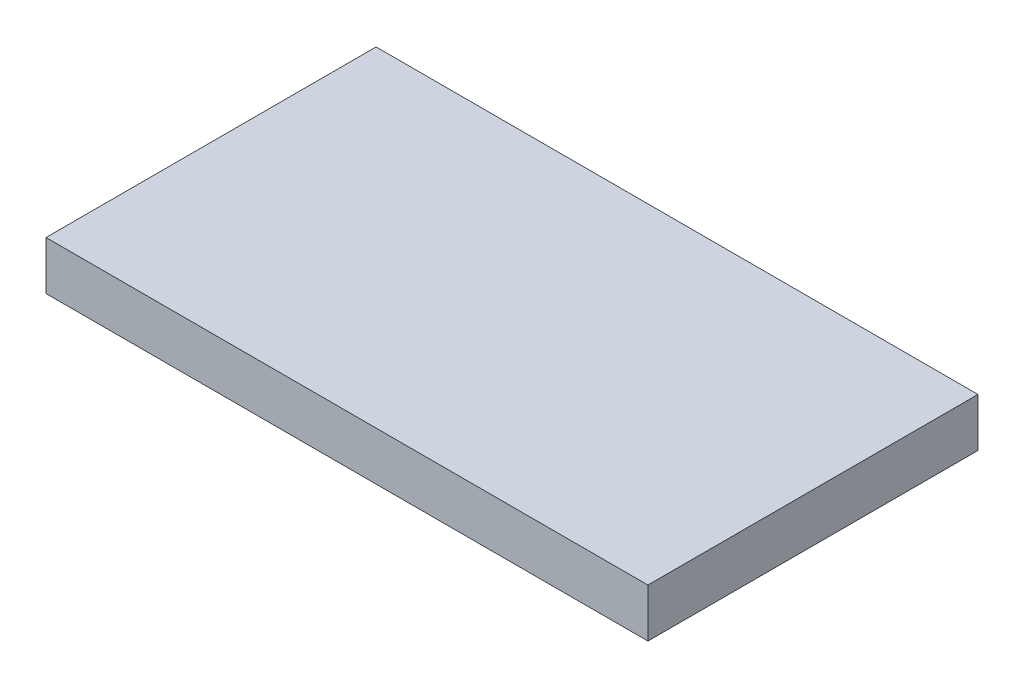
ISO-10303-21;
HEADER;
FILE_DESCRIPTION(('STEP AP214'),'2;1');
FILE_NAME('part.step','',(''),(''),'','','');
FILE_SCHEMA(('AUTOMOTIVE_DESIGN { 1 0 10303 214 1 1 1 1 }'));
ENDSEC;
DATA;
#1=APPLICATION_CONTEXT('core data for automotive mechanical design processes');
#2=APPLICATION_PROTOCOL_DEFINITION('international standard','automotive_design',2000,#1);
#3=PRODUCT_CONTEXT('',#1,'mechanical');
#4=PRODUCT('Part','Part','',(#3));
#5=PRODUCT_RELATED_PRODUCT_CATEGORY('part','',(#4));
#6=PRODUCT_DEFINITION_FORMATION('','',#4);
#7=PRODUCT_DEFINITION_CONTEXT('part definition',#1,'design');
#8=PRODUCT_DEFINITION('design','',#6,#7);
#9=PRODUCT_DEFINITION_SHAPE('','',#8);
#10=(LENGTH_UNIT() NAMED_UNIT(*) SI_UNIT(.MILLI.,.METRE.));
#11=(NAMED_UNIT(*) PLANE_ANGLE_UNIT() SI_UNIT($,.RADIAN.));
#12=(NAMED_UNIT(*) SI_UNIT($,.STERADIAN.) SOLID_ANGLE_UNIT());
#13=UNCERTAINTY_MEASURE_WITH_UNIT(LENGTH_MEASURE(1.E-05),#10,'distance_accuracy_value','');
#14=(GEOMETRIC_REPRESENTATION_CONTEXT(3) GLOBAL_UNCERTAINTY_ASSIGNED_CONTEXT((#13)) GLOBAL_UNIT_ASSIGNED_CONTEXT((#10,
#11,#12)) REPRESENTATION_CONTEXT('',''));
#15=CARTESIAN_POINT('',(0.,0.,0.));
#16=DIRECTION('',(0.,0.,1.));
#17=DIRECTION('',(1.,0.,0.));
#18=AXIS2_PLACEMENT_3D('',#15,#16,#17);
#19=CARTESIAN_POINT('',(0.,5.,0.));
#20=DIRECTION('',(1.,0.,0.));
#21=DIRECTION('',(0.,0.,-1.));
#22=AXIS2_PLACEMENT_3D('',#19,#20,#21);
#23=PLANE('',#22);
#24=DIRECTION('',(0.,0.,1.));
#25=VECTOR('',#24,1.);
#26=CARTESIAN_POINT('',(0.,0.,0.));
#27=LINE('',#26,#25);
#28=CARTESIAN_POINT('',(0.,0.,-34.));
#29=VERTEX_POINT('',#28);
#30=CARTESIAN_POINT('',(0.,0.,0.));
#31=VERTEX_POINT('',#30);
#32=EDGE_CURVE('E96',#29,#31,#27,.T.);
#33=ORIENTED_EDGE('',*,*,#32,.T.);
#34=DIRECTION('',(0.,-1.,0.));
#35=VECTOR('',#34,1.);
#36=CARTESIAN_POINT('',(0.,5.,0.));
#37=LINE('',#36,#35);
#38=CARTESIAN_POINT('',(0.,5.,0.));
#39=VERTEX_POINT('',#38);
#40=EDGE_CURVE('E11',#39,#31,#37,.T.);
#41=ORIENTED_EDGE('',*,*,#40,.F.);
#42=DIRECTION('',(0.,0.,1.));
#43=VECTOR('',#42,1.);
#44=CARTESIAN_POINT('',(0.,5.,0.));
#45=LINE('',#44,#43);
#46=CARTESIAN_POINT('',(0.,5.,-34.));
#47=VERTEX_POINT('',#46);
#48=EDGE_CURVE('E84',#47,#39,#45,.T.);
#49=ORIENTED_EDGE('',*,*,#48,.F.);
#50=DIRECTION('',(0.,-1.,0.));
#51=VECTOR('',#50,1.);
#52=CARTESIAN_POINT('',(0.,5.,-34.));
#53=LINE('',#52,#51);
#54=EDGE_CURVE('E92',#47,#29,#53,.T.);
#55=ORIENTED_EDGE('',*,*,#54,.T.);
#56=EDGE_LOOP('',(#33,#41,#49,#55));
#57=FACE_BOUND('',#56,.T.);
#58=ADVANCED_FACE('F33',(#57),#23,.F.);
#59=CARTESIAN_POINT('',(0.,5.,0.));
#60=DIRECTION('',(0.,0.,-1.));
#61=DIRECTION('',(-1.,0.,0.));
#62=AXIS2_PLACEMENT_3D('',#59,#60,#61);
#63=PLANE('',#62);
#64=DIRECTION('',(1.,0.,0.));
#65=VECTOR('',#64,1.);
#66=CARTESIAN_POINT('',(0.,0.,0.));
#67=LINE('',#66,#65);
#68=CARTESIAN_POINT('',(62.,0.,0.));
#69=VERTEX_POINT('',#68);
#70=EDGE_CURVE('E88',#31,#69,#67,.T.);
#71=ORIENTED_EDGE('',*,*,#70,.T.);
#72=DIRECTION('',(0.,-1.,0.));
#73=VECTOR('',#72,1.);
#74=CARTESIAN_POINT('',(62.,5.,0.));
#75=LINE('',#74,#73);
#76=CARTESIAN_POINT('',(62.,5.,0.));
#77=VERTEX_POINT('',#76);
#78=EDGE_CURVE('E41',#77,#69,#75,.T.);
#79=ORIENTED_EDGE('',*,*,#78,.F.);
#80=DIRECTION('',(1.,0.,0.));
#81=VECTOR('',#80,1.);
#82=CARTESIAN_POINT('',(0.,5.,0.));
#83=LINE('',#82,#81);
#84=EDGE_CURVE('E79',#39,#77,#83,.T.);
#85=ORIENTED_EDGE('',*,*,#84,.F.);
#86=ORIENTED_EDGE('',*,*,#40,.T.);
#87=EDGE_LOOP('',(#71,#79,#85,#86));
#88=FACE_BOUND('',#87,.T.);
#89=ADVANCED_FACE('F87',(#88),#63,.F.);
#90=CARTESIAN_POINT('',(62.,5.,0.));
#91=DIRECTION('',(-1.,0.,0.));
#92=DIRECTION('',(0.,0.,1.));
#93=AXIS2_PLACEMENT_3D('',#90,#91,#92);
#94=PLANE('',#93);
#95=DIRECTION('',(0.,0.,-1.));
#96=VECTOR('',#95,1.);
#97=CARTESIAN_POINT('',(62.,0.,0.));
#98=LINE('',#97,#96);
#99=CARTESIAN_POINT('',(62.,0.,-34.));
#100=VERTEX_POINT('',#99);
#101=EDGE_CURVE('E66',#69,#100,#98,.T.);
#102=ORIENTED_EDGE('',*,*,#101,.T.);
#103=DIRECTION('',(0.,-1.,0.));
#104=VECTOR('',#103,1.);
#105=CARTESIAN_POINT('',(62.,5.,-34.));
#106=LINE('',#105,#104);
#107=CARTESIAN_POINT('',(62.,5.,-34.));
#108=VERTEX_POINT('',#107);
#109=EDGE_CURVE('E89',#108,#100,#106,.T.);
#110=ORIENTED_EDGE('',*,*,#109,.F.);
#111=DIRECTION('',(0.,0.,-1.));
#112=VECTOR('',#111,1.);
#113=CARTESIAN_POINT('',(62.,5.,0.));
#114=LINE('',#113,#112);
#115=EDGE_CURVE('E82',#77,#108,#114,.T.);
#116=ORIENTED_EDGE('',*,*,#115,.F.);
#117=ORIENTED_EDGE('',*,*,#78,.T.);
#118=EDGE_LOOP('',(#102,#110,#116,#117));
#119=FACE_BOUND('',#118,.T.);
#120=ADVANCED_FACE('F90',(#119),#94,.F.);
#121=CARTESIAN_POINT('',(0.,5.,-34.));
#122=DIRECTION('',(0.,0.,1.));
#123=DIRECTION('',(1.,0.,0.));
#124=AXIS2_PLACEMENT_3D('',#121,#122,#123);
#125=PLANE('',#124);
#126=DIRECTION('',(-1.,0.,0.));
#127=VECTOR('',#126,1.);
#128=CARTESIAN_POINT('',(0.,0.,-34.));
#129=LINE('',#128,#127);
#130=EDGE_CURVE('E72',#100,#29,#129,.T.);
#131=ORIENTED_EDGE('',*,*,#130,.T.);
#132=ORIENTED_EDGE('',*,*,#54,.F.);
#133=DIRECTION('',(-1.,0.,0.));
#134=VECTOR('',#133,1.);
#135=CARTESIAN_POINT('',(0.,5.,-34.));
#136=LINE('',#135,#134);
#137=EDGE_CURVE('E49',#108,#47,#136,.T.);
#138=ORIENTED_EDGE('',*,*,#137,.F.);
#139=ORIENTED_EDGE('',*,*,#109,.T.);
#140=EDGE_LOOP('',(#131,#132,#138,#139));
#141=FACE_BOUND('',#140,.T.);
#142=ADVANCED_FACE('F103',(#141),#125,.F.);
#143=CARTESIAN_POINT('',(0.,5.,0.));
#144=DIRECTION('',(0.,-1.,0.));
#145=DIRECTION('',(0.,0.,-1.));
#146=AXIS2_PLACEMENT_3D('',#143,#144,#145);
#147=PLANE('',#146);
#148=ORIENTED_EDGE('',*,*,#48,.T.);
#149=ORIENTED_EDGE('',*,*,#84,.T.);
#150=ORIENTED_EDGE('',*,*,#115,.T.);
#151=ORIENTED_EDGE('',*,*,#137,.T.);
#152=EDGE_LOOP('',(#148,#149,#150,#151));
#153=FACE_BOUND('',#152,.T.);
#154=ADVANCED_FACE('F80',(#153),#147,.F.);
#155=CARTESIAN_POINT('',(0.,0.,0.));
#156=DIRECTION('',(0.,-1.,0.));
#157=DIRECTION('',(0.,0.,-1.));
#158=AXIS2_PLACEMENT_3D('',#155,#156,#157);
#159=PLANE('',#158);
#160=ORIENTED_EDGE('',*,*,#32,.F.);
#161=ORIENTED_EDGE('',*,*,#130,.F.);
#162=ORIENTED_EDGE('',*,*,#101,.F.);
#163=ORIENTED_EDGE('',*,*,#70,.F.);
#164=EDGE_LOOP('',(#160,#161,#162,#163));
#165=FACE_BOUND('',#164,.T.);
#166=ADVANCED_FACE('F106',(#165),#159,.T.);
#167=CLOSED_SHELL('',(#58,#89,#120,#142,#154,#166));
#168=MANIFOLD_SOLID_BREP('B2',#167);
#169=ADVANCED_BREP_SHAPE_REPRESENTATION('',(#18,#168),#14);
#170=SHAPE_DEFINITION_REPRESENTATION(#9,#169);
ENDSEC;
END-ISO-10303-21;
